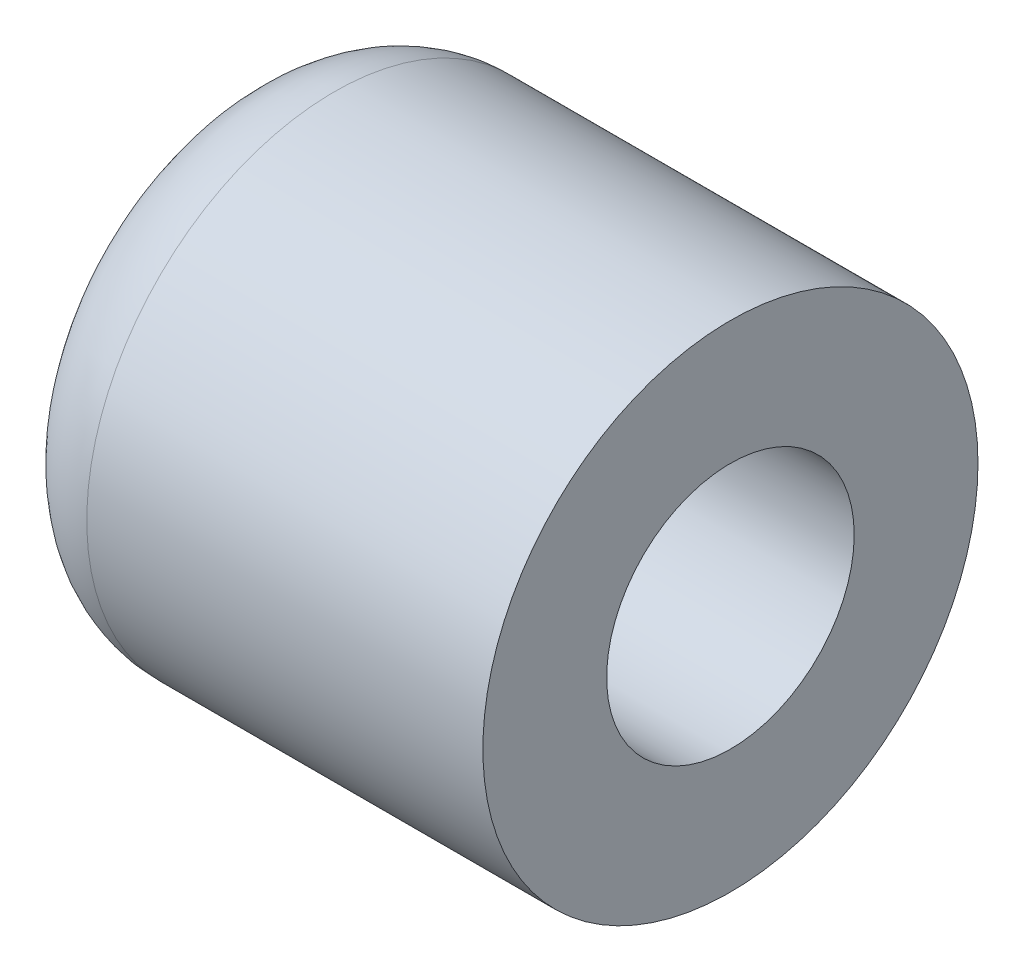
ISO-10303-21;
HEADER;
FILE_DESCRIPTION(('STEP AP214'),'2;1');
FILE_NAME('part.step','',(''),(''),'','','');
FILE_SCHEMA(('AUTOMOTIVE_DESIGN { 1 0 10303 214 1 1 1 1 }'));
ENDSEC;
DATA;
#1=APPLICATION_CONTEXT('core data for automotive mechanical design processes');
#2=APPLICATION_PROTOCOL_DEFINITION('international standard','automotive_design',2000,#1);
#3=PRODUCT_CONTEXT('',#1,'mechanical');
#4=PRODUCT('Part','Part','',(#3));
#5=PRODUCT_RELATED_PRODUCT_CATEGORY('part','',(#4));
#6=PRODUCT_DEFINITION_FORMATION('','',#4);
#7=PRODUCT_DEFINITION_CONTEXT('part definition',#1,'design');
#8=PRODUCT_DEFINITION('design','',#6,#7);
#9=PRODUCT_DEFINITION_SHAPE('','',#8);
#10=(LENGTH_UNIT() NAMED_UNIT(*) SI_UNIT(.MILLI.,.METRE.));
#11=(NAMED_UNIT(*) PLANE_ANGLE_UNIT() SI_UNIT($,.RADIAN.));
#12=(NAMED_UNIT(*) SI_UNIT($,.STERADIAN.) SOLID_ANGLE_UNIT());
#13=UNCERTAINTY_MEASURE_WITH_UNIT(LENGTH_MEASURE(1.E-05),#10,'distance_accuracy_value','');
#14=(GEOMETRIC_REPRESENTATION_CONTEXT(3) GLOBAL_UNCERTAINTY_ASSIGNED_CONTEXT((#13)) GLOBAL_UNIT_ASSIGNED_CONTEXT((#10,
#11,#12)) REPRESENTATION_CONTEXT('',''));
#15=CARTESIAN_POINT('',(0.,0.,0.));
#16=DIRECTION('',(0.,0.,1.));
#17=DIRECTION('',(1.,0.,0.));
#18=AXIS2_PLACEMENT_3D('',#15,#16,#17);
#19=CARTESIAN_POINT('',(10.,0.,0.));
#20=DIRECTION('',(-1.,0.,0.));
#21=DIRECTION('',(0.,0.,1.));
#22=AXIS2_PLACEMENT_3D('',#19,#20,#21);
#23=CYLINDRICAL_SURFACE('',#22,5.);
#24=CARTESIAN_POINT('',(2.,0.,0.));
#25=DIRECTION('',(1.,0.,0.));
#26=DIRECTION('',(0.,0.,-1.));
#27=AXIS2_PLACEMENT_3D('',#24,#25,#26);
#28=CIRCLE('',#27,5.);
#29=CARTESIAN_POINT('',(2.,0.,-5.));
#30=VERTEX_POINT('',#29);
#31=EDGE_CURVE('E38',#30,#30,#28,.T.);
#32=ORIENTED_EDGE('',*,*,#31,.T.);
#33=EDGE_LOOP('',(#32));
#34=FACE_BOUND('',#33,.T.);
#35=CARTESIAN_POINT('',(10.,0.,0.));
#36=DIRECTION('',(1.,0.,0.));
#37=DIRECTION('',(0.,0.,-1.));
#38=AXIS2_PLACEMENT_3D('',#35,#36,#37);
#39=CIRCLE('',#38,5.);
#40=CARTESIAN_POINT('',(10.,0.,-5.));
#41=VERTEX_POINT('',#40);
#42=EDGE_CURVE('E42',#41,#41,#39,.T.);
#43=ORIENTED_EDGE('',*,*,#42,.F.);
#44=EDGE_LOOP('',(#43));
#45=FACE_BOUND('',#44,.T.);
#46=ADVANCED_FACE('F31',(#34,#45),#23,.T.);
#47=CARTESIAN_POINT('',(10.,0.,0.));
#48=DIRECTION('',(1.,0.,0.));
#49=DIRECTION('',(0.,0.,-1.));
#50=AXIS2_PLACEMENT_3D('',#47,#48,#49);
#51=PLANE('',#50);
#52=CARTESIAN_POINT('',(10.,0.,0.));
#53=DIRECTION('',(1.,0.,0.));
#54=DIRECTION('',(0.,0.,-1.));
#55=AXIS2_PLACEMENT_3D('',#52,#53,#54);
#56=CIRCLE('',#55,2.5);
#57=CARTESIAN_POINT('',(10.,0.,-2.5));
#58=VERTEX_POINT('',#57);
#59=EDGE_CURVE('E49',#58,#58,#56,.T.);
#60=ORIENTED_EDGE('',*,*,#59,.F.);
#61=EDGE_LOOP('',(#60));
#62=FACE_BOUND('',#61,.T.);
#63=ORIENTED_EDGE('',*,*,#42,.T.);
#64=EDGE_LOOP('',(#63));
#65=FACE_BOUND('',#64,.T.);
#66=ADVANCED_FACE('F63',(#62,#65),#51,.T.);
#67=CARTESIAN_POINT('',(0.,0.,0.));
#68=DIRECTION('',(1.,0.,0.));
#69=DIRECTION('',(0.,0.,-1.));
#70=AXIS2_PLACEMENT_3D('',#67,#68,#69);
#71=PLANE('',#70);
#72=CARTESIAN_POINT('',(0.,0.,0.));
#73=DIRECTION('',(1.,0.,0.));
#74=DIRECTION('',(0.,0.,-1.));
#75=AXIS2_PLACEMENT_3D('',#72,#73,#74);
#76=CIRCLE('',#75,3.);
#77=CARTESIAN_POINT('',(0.,0.,-3.));
#78=VERTEX_POINT('',#77);
#79=EDGE_CURVE('E10',#78,#78,#76,.F.);
#80=ORIENTED_EDGE('',*,*,#79,.T.);
#81=EDGE_LOOP('',(#80));
#82=FACE_BOUND('',#81,.T.);
#83=ADVANCED_FACE('F66',(#82),#71,.F.);
#84=CARTESIAN_POINT('',(2.,0.,0.));
#85=DIRECTION('',(1.,0.,0.));
#86=DIRECTION('',(0.,0.,-1.));
#87=AXIS2_PLACEMENT_3D('',#84,#85,#86);
#88=TOROIDAL_SURFACE('',#87,3.,2.);
#89=ORIENTED_EDGE('',*,*,#79,.F.);
#90=EDGE_LOOP('',(#89));
#91=FACE_BOUND('',#90,.T.);
#92=ORIENTED_EDGE('',*,*,#31,.F.);
#93=EDGE_LOOP('',(#92));
#94=FACE_BOUND('',#93,.T.);
#95=ADVANCED_FACE('F33',(#91,#94),#88,.T.);
#96=CARTESIAN_POINT('',(3.,0.,0.));
#97=DIRECTION('',(1.,0.,0.));
#98=DIRECTION('',(0.,0.,-1.));
#99=AXIS2_PLACEMENT_3D('',#96,#97,#98);
#100=CYLINDRICAL_SURFACE('',#99,2.5);
#101=CARTESIAN_POINT('',(3.,0.,0.));
#102=DIRECTION('',(1.,0.,0.));
#103=DIRECTION('',(0.,0.,-1.));
#104=AXIS2_PLACEMENT_3D('',#101,#102,#103);
#105=CIRCLE('',#104,2.5);
#106=CARTESIAN_POINT('',(3.,0.,-2.5));
#107=VERTEX_POINT('',#106);
#108=EDGE_CURVE('E46',#107,#107,#105,.T.);
#109=ORIENTED_EDGE('',*,*,#108,.F.);
#110=EDGE_LOOP('',(#109));
#111=FACE_BOUND('',#110,.T.);
#112=ORIENTED_EDGE('',*,*,#59,.T.);
#113=EDGE_LOOP('',(#112));
#114=FACE_BOUND('',#113,.T.);
#115=ADVANCED_FACE('F57',(#111,#114),#100,.F.);
#116=CARTESIAN_POINT('',(3.,0.,0.));
#117=DIRECTION('',(1.,0.,0.));
#118=DIRECTION('',(0.,0.,-1.));
#119=AXIS2_PLACEMENT_3D('',#116,#117,#118);
#120=PLANE('',#119);
#121=ORIENTED_EDGE('',*,*,#108,.T.);
#122=EDGE_LOOP('',(#121));
#123=FACE_BOUND('',#122,.T.);
#124=ADVANCED_FACE('F55',(#123),#120,.T.);
#125=CLOSED_SHELL('',(#46,#66,#83,#95,#115,#124));
#126=MANIFOLD_SOLID_BREP('B2',#125);
#127=ADVANCED_BREP_SHAPE_REPRESENTATION('',(#18,#126),#14);
#128=SHAPE_DEFINITION_REPRESENTATION(#9,#127);
ENDSEC;
END-ISO-10303-21;
